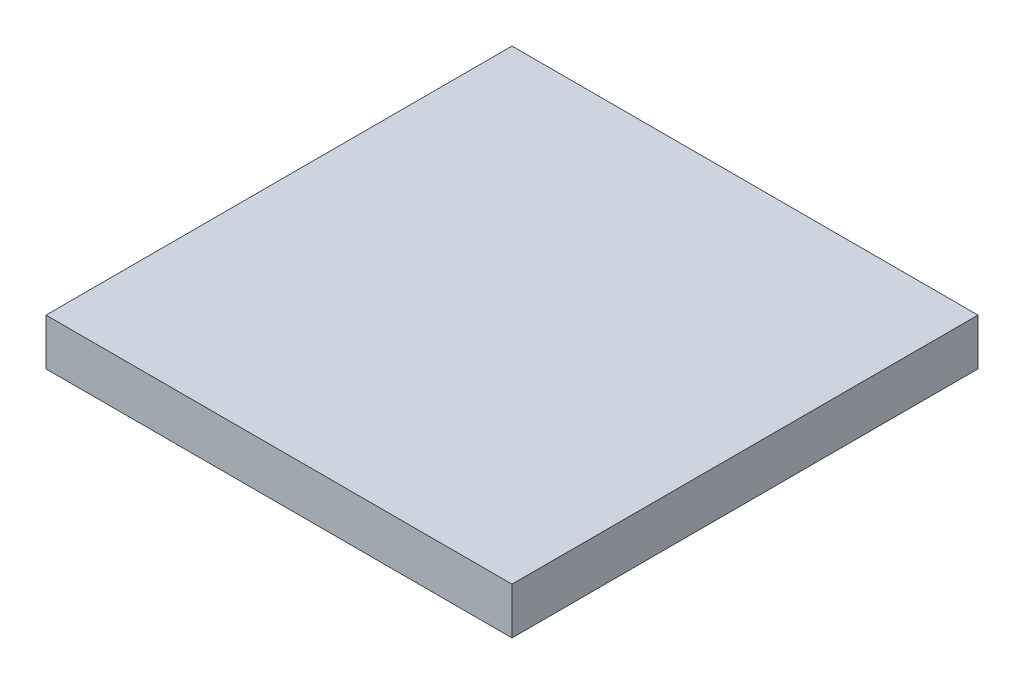
ISO-10303-21;
HEADER;
FILE_DESCRIPTION(('STEP AP214'),'2;1');
FILE_NAME('part.step','',(''),(''),'','','');
FILE_SCHEMA(('AUTOMOTIVE_DESIGN { 1 0 10303 214 1 1 1 1 }'));
ENDSEC;
DATA;
#1=APPLICATION_CONTEXT('core data for automotive mechanical design processes');
#2=APPLICATION_PROTOCOL_DEFINITION('international standard','automotive_design',2000,#1);
#3=PRODUCT_CONTEXT('',#1,'mechanical');
#4=PRODUCT('Part','Part','',(#3));
#5=PRODUCT_RELATED_PRODUCT_CATEGORY('part','',(#4));
#6=PRODUCT_DEFINITION_FORMATION('','',#4);
#7=PRODUCT_DEFINITION_CONTEXT('part definition',#1,'design');
#8=PRODUCT_DEFINITION('design','',#6,#7);
#9=PRODUCT_DEFINITION_SHAPE('','',#8);
#10=(LENGTH_UNIT() NAMED_UNIT(*) SI_UNIT(.MILLI.,.METRE.));
#11=(NAMED_UNIT(*) PLANE_ANGLE_UNIT() SI_UNIT($,.RADIAN.));
#12=(NAMED_UNIT(*) SI_UNIT($,.STERADIAN.) SOLID_ANGLE_UNIT());
#13=UNCERTAINTY_MEASURE_WITH_UNIT(LENGTH_MEASURE(1.E-05),#10,'distance_accuracy_value','');
#14=(GEOMETRIC_REPRESENTATION_CONTEXT(3) GLOBAL_UNCERTAINTY_ASSIGNED_CONTEXT((#13)) GLOBAL_UNIT_ASSIGNED_CONTEXT((#10,
#11,#12)) REPRESENTATION_CONTEXT('',''));
#15=CARTESIAN_POINT('',(0.,0.,0.));
#16=DIRECTION('',(0.,0.,1.));
#17=DIRECTION('',(1.,0.,0.));
#18=AXIS2_PLACEMENT_3D('',#15,#16,#17);
#19=CARTESIAN_POINT('',(0.,10.,0.));
#20=DIRECTION('',(1.,0.,0.));
#21=DIRECTION('',(0.,0.,-1.));
#22=AXIS2_PLACEMENT_3D('',#19,#20,#21);
#23=PLANE('',#22);
#24=DIRECTION('',(0.,0.,1.));
#25=VECTOR('',#24,1.);
#26=CARTESIAN_POINT('',(0.,0.,0.));
#27=LINE('',#26,#25);
#28=CARTESIAN_POINT('',(0.,0.,-100.));
#29=VERTEX_POINT('',#28);
#30=CARTESIAN_POINT('',(0.,0.,0.));
#31=VERTEX_POINT('',#30);
#32=EDGE_CURVE('E107',#29,#31,#27,.T.);
#33=ORIENTED_EDGE('',*,*,#32,.T.);
#34=DIRECTION('',(0.,-1.,0.));
#35=VECTOR('',#34,1.);
#36=CARTESIAN_POINT('',(0.,10.,0.));
#37=LINE('',#36,#35);
#38=CARTESIAN_POINT('',(0.,10.,0.));
#39=VERTEX_POINT('',#38);
#40=EDGE_CURVE('E11',#39,#31,#37,.T.);
#41=ORIENTED_EDGE('',*,*,#40,.F.);
#42=DIRECTION('',(0.,0.,1.));
#43=VECTOR('',#42,1.);
#44=CARTESIAN_POINT('',(0.,10.,0.));
#45=LINE('',#44,#43);
#46=CARTESIAN_POINT('',(0.,10.,-100.));
#47=VERTEX_POINT('',#46);
#48=EDGE_CURVE('E91',#47,#39,#45,.T.);
#49=ORIENTED_EDGE('',*,*,#48,.F.);
#50=DIRECTION('',(0.,-1.,0.));
#51=VECTOR('',#50,1.);
#52=CARTESIAN_POINT('',(0.,10.,-100.));
#53=LINE('',#52,#51);
#54=EDGE_CURVE('E103',#47,#29,#53,.T.);
#55=ORIENTED_EDGE('',*,*,#54,.T.);
#56=EDGE_LOOP('',(#33,#41,#49,#55));
#57=FACE_BOUND('',#56,.T.);
#58=ADVANCED_FACE('F39',(#57),#23,.F.);
#59=CARTESIAN_POINT('',(0.,10.,0.));
#60=DIRECTION('',(0.,0.,-1.));
#61=DIRECTION('',(-1.,0.,0.));
#62=AXIS2_PLACEMENT_3D('',#59,#60,#61);
#63=PLANE('',#62);
#64=DIRECTION('',(1.,0.,0.));
#65=VECTOR('',#64,1.);
#66=CARTESIAN_POINT('',(0.,0.,0.));
#67=LINE('',#66,#65);
#68=CARTESIAN_POINT('',(100.,0.,0.));
#69=VERTEX_POINT('',#68);
#70=EDGE_CURVE('E96',#31,#69,#67,.T.);
#71=ORIENTED_EDGE('',*,*,#70,.T.);
#72=DIRECTION('',(0.,-1.,0.));
#73=VECTOR('',#72,1.);
#74=CARTESIAN_POINT('',(100.,10.,0.));
#75=LINE('',#74,#73);
#76=CARTESIAN_POINT('',(100.,10.,0.));
#77=VERTEX_POINT('',#76);
#78=EDGE_CURVE('E48',#77,#69,#75,.T.);
#79=ORIENTED_EDGE('',*,*,#78,.F.);
#80=DIRECTION('',(1.,0.,0.));
#81=VECTOR('',#80,1.);
#82=CARTESIAN_POINT('',(0.,10.,0.));
#83=LINE('',#82,#81);
#84=EDGE_CURVE('E86',#39,#77,#83,.T.);
#85=ORIENTED_EDGE('',*,*,#84,.F.);
#86=ORIENTED_EDGE('',*,*,#40,.T.);
#87=EDGE_LOOP('',(#71,#79,#85,#86));
#88=FACE_BOUND('',#87,.T.);
#89=ADVANCED_FACE('F95',(#88),#63,.F.);
#90=CARTESIAN_POINT('',(100.,10.,0.));
#91=DIRECTION('',(-1.,0.,0.));
#92=DIRECTION('',(0.,0.,1.));
#93=AXIS2_PLACEMENT_3D('',#90,#91,#92);
#94=PLANE('',#93);
#95=DIRECTION('',(0.,0.,-1.));
#96=VECTOR('',#95,1.);
#97=CARTESIAN_POINT('',(100.,0.,0.));
#98=LINE('',#97,#96);
#99=CARTESIAN_POINT('',(100.,0.,-100.));
#100=VERTEX_POINT('',#99);
#101=EDGE_CURVE('E73',#69,#100,#98,.T.);
#102=ORIENTED_EDGE('',*,*,#101,.T.);
#103=DIRECTION('',(0.,-1.,0.));
#104=VECTOR('',#103,1.);
#105=CARTESIAN_POINT('',(100.,10.,-100.));
#106=LINE('',#105,#104);
#107=CARTESIAN_POINT('',(100.,10.,-100.));
#108=VERTEX_POINT('',#107);
#109=EDGE_CURVE('E98',#108,#100,#106,.T.);
#110=ORIENTED_EDGE('',*,*,#109,.F.);
#111=DIRECTION('',(0.,0.,-1.));
#112=VECTOR('',#111,1.);
#113=CARTESIAN_POINT('',(100.,10.,0.));
#114=LINE('',#113,#112);
#115=EDGE_CURVE('E89',#77,#108,#114,.T.);
#116=ORIENTED_EDGE('',*,*,#115,.F.);
#117=ORIENTED_EDGE('',*,*,#78,.T.);
#118=EDGE_LOOP('',(#102,#110,#116,#117));
#119=FACE_BOUND('',#118,.T.);
#120=ADVANCED_FACE('F99',(#119),#94,.F.);
#121=CARTESIAN_POINT('',(0.,10.,-100.));
#122=DIRECTION('',(0.,0.,1.));
#123=DIRECTION('',(1.,0.,0.));
#124=AXIS2_PLACEMENT_3D('',#121,#122,#123);
#125=PLANE('',#124);
#126=DIRECTION('',(-1.,0.,0.));
#127=VECTOR('',#126,1.);
#128=CARTESIAN_POINT('',(0.,0.,-100.));
#129=LINE('',#128,#127);
#130=EDGE_CURVE('E79',#100,#29,#129,.T.);
#131=ORIENTED_EDGE('',*,*,#130,.T.);
#132=ORIENTED_EDGE('',*,*,#54,.F.);
#133=DIRECTION('',(-1.,0.,0.));
#134=VECTOR('',#133,1.);
#135=CARTESIAN_POINT('',(0.,10.,-100.));
#136=LINE('',#135,#134);
#137=EDGE_CURVE('E56',#108,#47,#136,.T.);
#138=ORIENTED_EDGE('',*,*,#137,.F.);
#139=ORIENTED_EDGE('',*,*,#109,.T.);
#140=EDGE_LOOP('',(#131,#132,#138,#139));
#141=FACE_BOUND('',#140,.T.);
#142=ADVANCED_FACE('F120',(#141),#125,.F.);
#143=CARTESIAN_POINT('',(0.,10.,0.));
#144=DIRECTION('',(0.,-1.,0.));
#145=DIRECTION('',(0.,0.,-1.));
#146=AXIS2_PLACEMENT_3D('',#143,#144,#145);
#147=PLANE('',#146);
#148=ORIENTED_EDGE('',*,*,#48,.T.);
#149=ORIENTED_EDGE('',*,*,#84,.T.);
#150=ORIENTED_EDGE('',*,*,#115,.T.);
#151=ORIENTED_EDGE('',*,*,#137,.T.);
#152=EDGE_LOOP('',(#148,#149,#150,#151));
#153=FACE_BOUND('',#152,.T.);
#154=ADVANCED_FACE('F87',(#153),#147,.F.);
#155=CARTESIAN_POINT('',(0.,0.,0.));
#156=DIRECTION('',(0.,-1.,0.));
#157=DIRECTION('',(0.,0.,-1.));
#158=AXIS2_PLACEMENT_3D('',#155,#156,#157);
#159=PLANE('',#158);
#160=ORIENTED_EDGE('',*,*,#32,.F.);
#161=ORIENTED_EDGE('',*,*,#130,.F.);
#162=ORIENTED_EDGE('',*,*,#101,.F.);
#163=ORIENTED_EDGE('',*,*,#70,.F.);
#164=EDGE_LOOP('',(#160,#161,#162,#163));
#165=FACE_BOUND('',#164,.T.);
#166=ADVANCED_FACE('F123',(#165),#159,.T.);
#167=CLOSED_SHELL('',(#58,#89,#120,#142,#154,#166));
#168=MANIFOLD_SOLID_BREP('B2',#167);
#169=ADVANCED_BREP_SHAPE_REPRESENTATION('',(#18,#168),#14);
#170=SHAPE_DEFINITION_REPRESENTATION(#9,#169);
ENDSEC;
END-ISO-10303-21;
